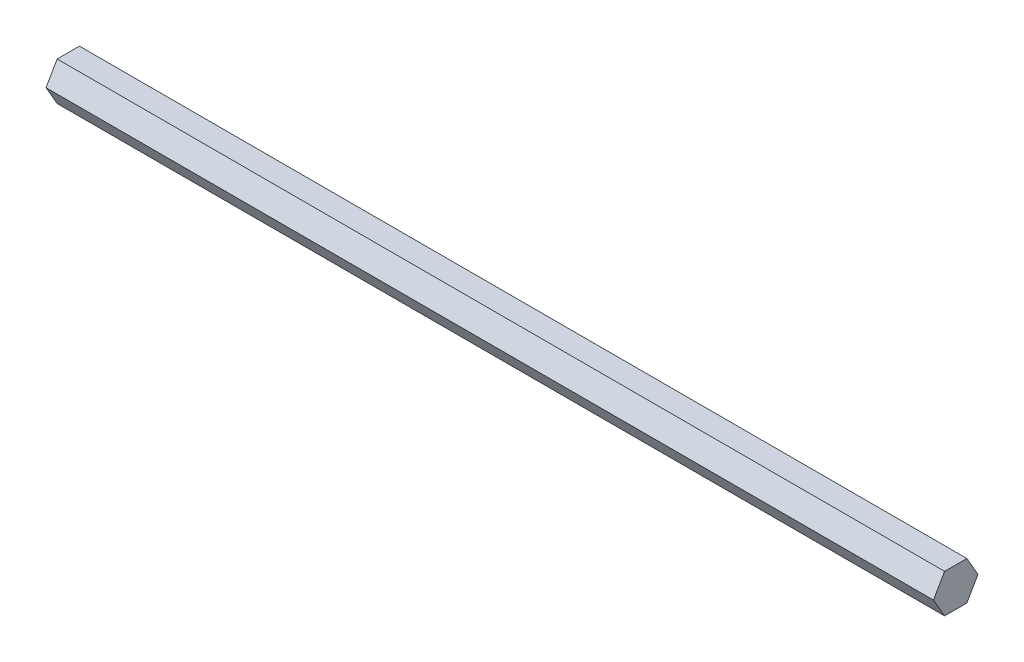
ISO-10303-21;
HEADER;
FILE_DESCRIPTION(('STEP AP214'),'2;1');
FILE_NAME('part.step','',(''),(''),'','','');
FILE_SCHEMA(('AUTOMOTIVE_DESIGN { 1 0 10303 214 1 1 1 1 }'));
ENDSEC;
DATA;
#1=APPLICATION_CONTEXT('core data for automotive mechanical design processes');
#2=APPLICATION_PROTOCOL_DEFINITION('international standard','automotive_design',2000,#1);
#3=PRODUCT_CONTEXT('',#1,'mechanical');
#4=PRODUCT('Part','Part','',(#3));
#5=PRODUCT_RELATED_PRODUCT_CATEGORY('part','',(#4));
#6=PRODUCT_DEFINITION_FORMATION('','',#4);
#7=PRODUCT_DEFINITION_CONTEXT('part definition',#1,'design');
#8=PRODUCT_DEFINITION('design','',#6,#7);
#9=PRODUCT_DEFINITION_SHAPE('','',#8);
#10=(LENGTH_UNIT() NAMED_UNIT(*) SI_UNIT(.MILLI.,.METRE.));
#11=(NAMED_UNIT(*) PLANE_ANGLE_UNIT() SI_UNIT($,.RADIAN.));
#12=(NAMED_UNIT(*) SI_UNIT($,.STERADIAN.) SOLID_ANGLE_UNIT());
#13=UNCERTAINTY_MEASURE_WITH_UNIT(LENGTH_MEASURE(1.E-05),#10,'distance_accuracy_value','');
#14=(GEOMETRIC_REPRESENTATION_CONTEXT(3) GLOBAL_UNCERTAINTY_ASSIGNED_CONTEXT((#13)) GLOBAL_UNIT_ASSIGNED_CONTEXT((#10,
#11,#12)) REPRESENTATION_CONTEXT('',''));
#15=CARTESIAN_POINT('',(0.,0.,0.));
#16=DIRECTION('',(0.,0.,1.));
#17=DIRECTION('',(1.,0.,0.));
#18=AXIS2_PLACEMENT_3D('',#15,#16,#17);
#19=CARTESIAN_POINT('',(292.1,-6.34999999999996,-3.6661742093542));
#20=DIRECTION('',(0.,0.499999999999995,0.866025403784442));
#21=DIRECTION('',(0.,-0.866025403784441,0.499999999999995));
#22=AXIS2_PLACEMENT_3D('',#19,#20,#21);
#23=PLANE('',#22);
#24=DIRECTION('',(0.,0.866025403784442,-0.499999999999995));
#25=VECTOR('',#24,1.);
#26=CARTESIAN_POINT('',(0.,-6.34999999999996,-3.6661742093542));
#27=LINE('',#26,#25);
#28=CARTESIAN_POINT('',(0.,-6.34999999999996,-3.6661742093542));
#29=VERTEX_POINT('',#28);
#30=CARTESIAN_POINT('',(0.,0.,-7.33234841870825));
#31=VERTEX_POINT('',#30);
#32=EDGE_CURVE('E117',#29,#31,#27,.T.);
#33=ORIENTED_EDGE('',*,*,#32,.T.);
#34=DIRECTION('',(-1.,0.,0.));
#35=VECTOR('',#34,1.);
#36=CARTESIAN_POINT('',(292.1,0.,-7.33234841870825));
#37=LINE('',#36,#35);
#38=CARTESIAN_POINT('',(292.1,0.,-7.33234841870825));
#39=VERTEX_POINT('',#38);
#40=EDGE_CURVE('E11',#39,#31,#37,.T.);
#41=ORIENTED_EDGE('',*,*,#40,.F.);
#42=DIRECTION('',(0.,0.866025403784442,-0.499999999999995));
#43=VECTOR('',#42,1.);
#44=CARTESIAN_POINT('',(292.1,-6.34999999999996,-3.6661742093542));
#45=LINE('',#44,#43);
#46=CARTESIAN_POINT('',(292.1,-6.34999999999996,-3.6661742093542));
#47=VERTEX_POINT('',#46);
#48=EDGE_CURVE('E127',#47,#39,#45,.T.);
#49=ORIENTED_EDGE('',*,*,#48,.F.);
#50=DIRECTION('',(-1.,0.,0.));
#51=VECTOR('',#50,1.);
#52=CARTESIAN_POINT('',(292.1,-6.34999999999996,-3.6661742093542));
#53=LINE('',#52,#51);
#54=EDGE_CURVE('E113',#47,#29,#53,.T.);
#55=ORIENTED_EDGE('',*,*,#54,.T.);
#56=EDGE_LOOP('',(#33,#41,#49,#55));
#57=FACE_BOUND('',#56,.T.);
#58=ADVANCED_FACE('F33',(#57),#23,.F.);
#59=CARTESIAN_POINT('',(292.1,0.,-7.33234841870825));
#60=DIRECTION('',(0.,-0.500000000000001,0.866025403784438));
#61=DIRECTION('',(0.,-0.866025403784438,-0.500000000000001));
#62=AXIS2_PLACEMENT_3D('',#59,#60,#61);
#63=PLANE('',#62);
#64=DIRECTION('',(0.,0.866025403784438,0.500000000000001));
#65=VECTOR('',#64,1.);
#66=CARTESIAN_POINT('',(0.,0.,-7.33234841870825));
#67=LINE('',#66,#65);
#68=CARTESIAN_POINT('',(0.,6.35000000000001,-3.66617420935411));
#69=VERTEX_POINT('',#68);
#70=EDGE_CURVE('E120',#31,#69,#67,.T.);
#71=ORIENTED_EDGE('',*,*,#70,.T.);
#72=DIRECTION('',(-1.,0.,0.));
#73=VECTOR('',#72,1.);
#74=CARTESIAN_POINT('',(292.1,6.35000000000001,-3.66617420935411));
#75=LINE('',#74,#73);
#76=CARTESIAN_POINT('',(292.1,6.35000000000001,-3.66617420935411));
#77=VERTEX_POINT('',#76);
#78=EDGE_CURVE('E41',#77,#69,#75,.T.);
#79=ORIENTED_EDGE('',*,*,#78,.F.);
#80=DIRECTION('',(0.,0.866025403784438,0.500000000000001));
#81=VECTOR('',#80,1.);
#82=CARTESIAN_POINT('',(292.1,0.,-7.33234841870825));
#83=LINE('',#82,#81);
#84=EDGE_CURVE('E86',#39,#77,#83,.T.);
#85=ORIENTED_EDGE('',*,*,#84,.F.);
#86=ORIENTED_EDGE('',*,*,#40,.T.);
#87=EDGE_LOOP('',(#71,#79,#85,#86));
#88=FACE_BOUND('',#87,.T.);
#89=ADVANCED_FACE('F151',(#88),#63,.F.);
#90=CARTESIAN_POINT('',(292.1,6.35000000000001,-3.66617420935411));
#91=DIRECTION('',(0.,-1.,0.));
#92=DIRECTION('',(0.,0.,-1.));
#93=AXIS2_PLACEMENT_3D('',#90,#91,#92);
#94=PLANE('',#93);
#95=DIRECTION('',(0.,0.,1.));
#96=VECTOR('',#95,1.);
#97=CARTESIAN_POINT('',(0.,6.35000000000001,-3.66617420935411));
#98=LINE('',#97,#96);
#99=CARTESIAN_POINT('',(0.,6.34999999999999,3.66617420935416));
#100=VERTEX_POINT('',#99);
#101=EDGE_CURVE('E122',#69,#100,#98,.T.);
#102=ORIENTED_EDGE('',*,*,#101,.T.);
#103=DIRECTION('',(-1.,0.,0.));
#104=VECTOR('',#103,1.);
#105=CARTESIAN_POINT('',(292.1,6.34999999999999,3.66617420935416));
#106=LINE('',#105,#104);
#107=CARTESIAN_POINT('',(292.1,6.34999999999999,3.66617420935416));
#108=VERTEX_POINT('',#107);
#109=EDGE_CURVE('E108',#108,#100,#106,.T.);
#110=ORIENTED_EDGE('',*,*,#109,.F.);
#111=DIRECTION('',(0.,0.,1.));
#112=VECTOR('',#111,1.);
#113=CARTESIAN_POINT('',(292.1,6.35000000000001,-3.66617420935411));
#114=LINE('',#113,#112);
#115=EDGE_CURVE('E99',#77,#108,#114,.T.);
#116=ORIENTED_EDGE('',*,*,#115,.F.);
#117=ORIENTED_EDGE('',*,*,#78,.T.);
#118=EDGE_LOOP('',(#102,#110,#116,#117));
#119=FACE_BOUND('',#118,.T.);
#120=ADVANCED_FACE('F133',(#119),#94,.F.);
#121=CARTESIAN_POINT('',(292.1,6.34999999999999,3.66617420935416));
#122=DIRECTION('',(0.,-0.499999999999995,-0.866025403784442));
#123=DIRECTION('',(0.,0.866025403784441,-0.499999999999995));
#124=AXIS2_PLACEMENT_3D('',#121,#122,#123);
#125=PLANE('',#124);
#126=DIRECTION('',(0.,-0.866025403784442,0.499999999999995));
#127=VECTOR('',#126,1.);
#128=CARTESIAN_POINT('',(0.,6.34999999999999,3.66617420935416));
#129=LINE('',#128,#127);
#130=CARTESIAN_POINT('',(0.,0.,7.33234841870825));
#131=VERTEX_POINT('',#130);
#132=EDGE_CURVE('E107',#100,#131,#129,.T.);
#133=ORIENTED_EDGE('',*,*,#132,.T.);
#134=DIRECTION('',(-1.,0.,0.));
#135=VECTOR('',#134,1.);
#136=CARTESIAN_POINT('',(292.1,0.,7.33234841870825));
#137=LINE('',#136,#135);
#138=CARTESIAN_POINT('',(292.1,0.,7.33234841870825));
#139=VERTEX_POINT('',#138);
#140=EDGE_CURVE('E104',#139,#131,#137,.T.);
#141=ORIENTED_EDGE('',*,*,#140,.F.);
#142=DIRECTION('',(0.,-0.866025403784442,0.499999999999995));
#143=VECTOR('',#142,1.);
#144=CARTESIAN_POINT('',(292.1,6.34999999999999,3.66617420935416));
#145=LINE('',#144,#143);
#146=EDGE_CURVE('E93',#108,#139,#145,.T.);
#147=ORIENTED_EDGE('',*,*,#146,.F.);
#148=ORIENTED_EDGE('',*,*,#109,.T.);
#149=EDGE_LOOP('',(#133,#141,#147,#148));
#150=FACE_BOUND('',#149,.T.);
#151=ADVANCED_FACE('F105',(#150),#125,.F.);
#152=CARTESIAN_POINT('',(292.1,0.,7.33234841870825));
#153=DIRECTION('',(0.,0.500000000000007,-0.866025403784435));
#154=DIRECTION('',(0.,0.866025403784435,0.500000000000007));
#155=AXIS2_PLACEMENT_3D('',#152,#153,#154);
#156=PLANE('',#155);
#157=DIRECTION('',(0.,-0.866025403784435,-0.500000000000007));
#158=VECTOR('',#157,1.);
#159=CARTESIAN_POINT('',(0.,0.,7.33234841870825));
#160=LINE('',#159,#158);
#161=CARTESIAN_POINT('',(0.,-6.35000000000004,3.66617420935407));
#162=VERTEX_POINT('',#161);
#163=EDGE_CURVE('E72',#131,#162,#160,.T.);
#164=ORIENTED_EDGE('',*,*,#163,.T.);
#165=DIRECTION('',(-1.,0.,0.));
#166=VECTOR('',#165,1.);
#167=CARTESIAN_POINT('',(292.1,-6.35000000000004,3.66617420935407));
#168=LINE('',#167,#166);
#169=CARTESIAN_POINT('',(292.1,-6.35000000000004,3.66617420935407));
#170=VERTEX_POINT('',#169);
#171=EDGE_CURVE('E109',#170,#162,#168,.T.);
#172=ORIENTED_EDGE('',*,*,#171,.F.);
#173=DIRECTION('',(0.,-0.866025403784435,-0.500000000000007));
#174=VECTOR('',#173,1.);
#175=CARTESIAN_POINT('',(292.1,0.,7.33234841870825));
#176=LINE('',#175,#174);
#177=EDGE_CURVE('E97',#139,#170,#176,.T.);
#178=ORIENTED_EDGE('',*,*,#177,.F.);
#179=ORIENTED_EDGE('',*,*,#140,.T.);
#180=EDGE_LOOP('',(#164,#172,#178,#179));
#181=FACE_BOUND('',#180,.T.);
#182=ADVANCED_FACE('F111',(#181),#156,.F.);
#183=CARTESIAN_POINT('',(292.1,-6.35000000000004,3.66617420935407));
#184=DIRECTION('',(0.,1.,0.));
#185=DIRECTION('',(0.,0.,1.));
#186=AXIS2_PLACEMENT_3D('',#183,#184,#185);
#187=PLANE('',#186);
#188=DIRECTION('',(0.,0.,-1.));
#189=VECTOR('',#188,1.);
#190=CARTESIAN_POINT('',(0.,-6.35000000000004,3.66617420935407));
#191=LINE('',#190,#189);
#192=EDGE_CURVE('E78',#162,#29,#191,.T.);
#193=ORIENTED_EDGE('',*,*,#192,.T.);
#194=ORIENTED_EDGE('',*,*,#54,.F.);
#195=DIRECTION('',(0.,0.,-1.));
#196=VECTOR('',#195,1.);
#197=CARTESIAN_POINT('',(292.1,-6.35000000000004,3.66617420935407));
#198=LINE('',#197,#196);
#199=EDGE_CURVE('E49',#170,#47,#198,.T.);
#200=ORIENTED_EDGE('',*,*,#199,.F.);
#201=ORIENTED_EDGE('',*,*,#171,.T.);
#202=EDGE_LOOP('',(#193,#194,#200,#201));
#203=FACE_BOUND('',#202,.T.);
#204=ADVANCED_FACE('F140',(#203),#187,.F.);
#205=CARTESIAN_POINT('',(292.1,0.,0.));
#206=DIRECTION('',(1.,0.,0.));
#207=DIRECTION('',(0.,0.,-1.));
#208=AXIS2_PLACEMENT_3D('',#205,#206,#207);
#209=PLANE('',#208);
#210=ORIENTED_EDGE('',*,*,#48,.T.);
#211=ORIENTED_EDGE('',*,*,#84,.T.);
#212=ORIENTED_EDGE('',*,*,#115,.T.);
#213=ORIENTED_EDGE('',*,*,#146,.T.);
#214=ORIENTED_EDGE('',*,*,#177,.T.);
#215=ORIENTED_EDGE('',*,*,#199,.T.);
#216=EDGE_LOOP('',(#210,#211,#212,#213,#214,#215));
#217=FACE_BOUND('',#216,.T.);
#218=ADVANCED_FACE('F95',(#217),#209,.T.);
#219=CARTESIAN_POINT('',(0.,0.,0.));
#220=DIRECTION('',(1.,0.,0.));
#221=DIRECTION('',(0.,0.,-1.));
#222=AXIS2_PLACEMENT_3D('',#219,#220,#221);
#223=PLANE('',#222);
#224=ORIENTED_EDGE('',*,*,#32,.F.);
#225=ORIENTED_EDGE('',*,*,#192,.F.);
#226=ORIENTED_EDGE('',*,*,#163,.F.);
#227=ORIENTED_EDGE('',*,*,#132,.F.);
#228=ORIENTED_EDGE('',*,*,#101,.F.);
#229=ORIENTED_EDGE('',*,*,#70,.F.);
#230=EDGE_LOOP('',(#224,#225,#226,#227,#228,#229));
#231=FACE_BOUND('',#230,.T.);
#232=ADVANCED_FACE('F136',(#231),#223,.F.);
#233=CLOSED_SHELL('',(#58,#89,#120,#151,#182,#204,#218,#232));
#234=MANIFOLD_SOLID_BREP('B2',#233);
#235=ADVANCED_BREP_SHAPE_REPRESENTATION('',(#18,#234),#14);
#236=SHAPE_DEFINITION_REPRESENTATION(#9,#235);
ENDSEC;
END-ISO-10303-21;
